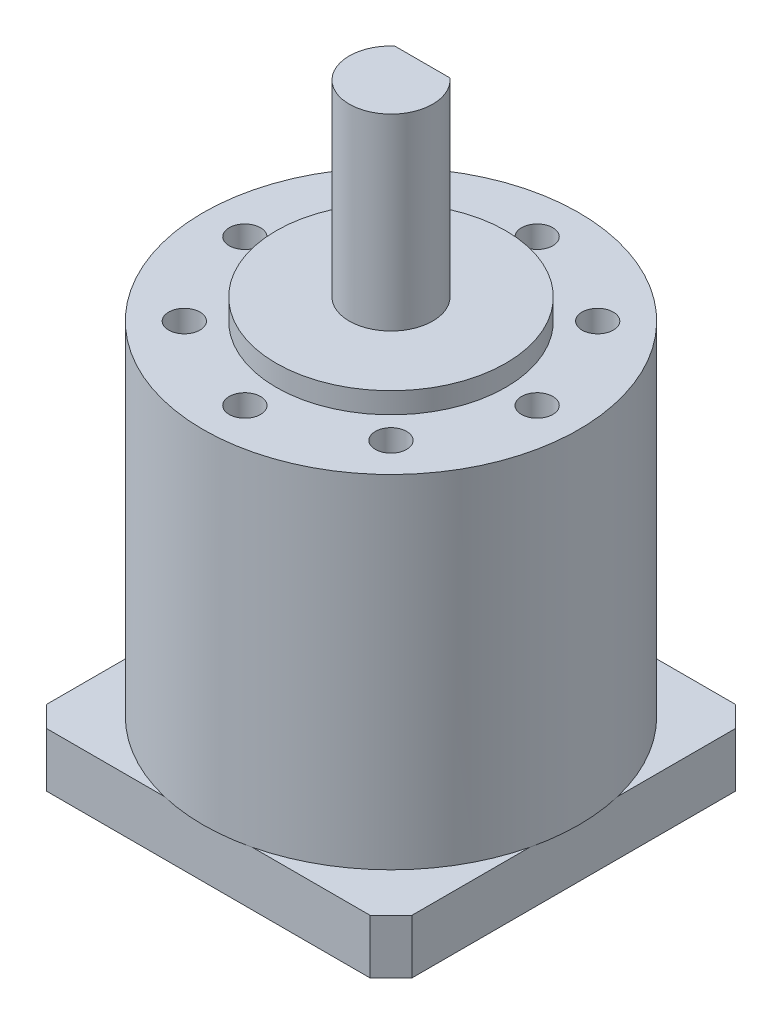
ISO-10303-21;
HEADER;
FILE_DESCRIPTION(('STEP AP214'),'2;1');
FILE_NAME('part.step','',(''),(''),'','','');
FILE_SCHEMA(('AUTOMOTIVE_DESIGN { 1 0 10303 214 1 1 1 1 }'));
ENDSEC;
DATA;
#1=APPLICATION_CONTEXT('core data for automotive mechanical design processes');
#2=APPLICATION_PROTOCOL_DEFINITION('international standard','automotive_design',2000,#1);
#3=PRODUCT_CONTEXT('',#1,'mechanical');
#4=PRODUCT('Part','Part','',(#3));
#5=PRODUCT_RELATED_PRODUCT_CATEGORY('part','',(#4));
#6=PRODUCT_DEFINITION_FORMATION('','',#4);
#7=PRODUCT_DEFINITION_CONTEXT('part definition',#1,'design');
#8=PRODUCT_DEFINITION('design','',#6,#7);
#9=PRODUCT_DEFINITION_SHAPE('','',#8);
#10=(LENGTH_UNIT() NAMED_UNIT(*) SI_UNIT(.MILLI.,.METRE.));
#11=(NAMED_UNIT(*) PLANE_ANGLE_UNIT() SI_UNIT($,.RADIAN.));
#12=(NAMED_UNIT(*) SI_UNIT($,.STERADIAN.) SOLID_ANGLE_UNIT());
#13=UNCERTAINTY_MEASURE_WITH_UNIT(LENGTH_MEASURE(1.E-05),#10,'distance_accuracy_value','');
#14=(GEOMETRIC_REPRESENTATION_CONTEXT(3) GLOBAL_UNCERTAINTY_ASSIGNED_CONTEXT((#13)) GLOBAL_UNIT_ASSIGNED_CONTEXT((#10,
#11,#12)) REPRESENTATION_CONTEXT('',''));
#15=CARTESIAN_POINT('',(0.,0.,0.));
#16=DIRECTION('',(0.,0.,1.));
#17=DIRECTION('',(1.,0.,0.));
#18=AXIS2_PLACEMENT_3D('',#15,#16,#17);
#19=CARTESIAN_POINT('',(0.,5.2,0.));
#20=DIRECTION('',(0.,1.,0.));
#21=DIRECTION('',(0.,0.,1.));
#22=AXIS2_PLACEMENT_3D('',#19,#20,#21);
#23=PLANE('',#22);
#24=DIRECTION('',(1.,0.,0.));
#25=VECTOR('',#24,1.);
#26=CARTESIAN_POINT('',(-17.5,5.2,17.5));
#27=LINE('',#26,#25);
#28=CARTESIAN_POINT('',(4.21307488658817,5.2,17.5));
#29=VERTEX_POINT('',#28);
#30=CARTESIAN_POINT('',(15.5,5.2,17.5));
#31=VERTEX_POINT('',#30);
#32=EDGE_CURVE('E197',#29,#31,#27,.T.);
#33=ORIENTED_EDGE('',*,*,#32,.T.);
#34=DIRECTION('',(-0.707106781186548,0.,0.707106781186547));
#35=VECTOR('',#34,1.);
#36=CARTESIAN_POINT('',(16.5,5.2,16.5));
#37=LINE('',#36,#35);
#38=CARTESIAN_POINT('',(17.5,5.2,15.5));
#39=VERTEX_POINT('',#38);
#40=EDGE_CURVE('E238',#31,#39,#37,.F.);
#41=ORIENTED_EDGE('',*,*,#40,.T.);
#42=DIRECTION('',(0.,0.,-1.));
#43=VECTOR('',#42,1.);
#44=CARTESIAN_POINT('',(17.5,5.2,-17.5));
#45=LINE('',#44,#43);
#46=CARTESIAN_POINT('',(17.5,5.2,4.21307488658818));
#47=VERTEX_POINT('',#46);
#48=EDGE_CURVE('E186',#39,#47,#45,.T.);
#49=ORIENTED_EDGE('',*,*,#48,.T.);
#50=CARTESIAN_POINT('',(0.,5.2,0.));
#51=DIRECTION('',(0.,1.,0.));
#52=DIRECTION('',(0.,0.,1.));
#53=AXIS2_PLACEMENT_3D('',#50,#51,#52);
#54=CIRCLE('',#53,18.);
#55=EDGE_CURVE('E181',#29,#47,#54,.T.);
#56=ORIENTED_EDGE('',*,*,#55,.F.);
#57=EDGE_LOOP('',(#33,#41,#49,#56));
#58=FACE_BOUND('',#57,.T.);
#59=ADVANCED_FACE('F40',(#58),#23,.T.);
#60=CARTESIAN_POINT('',(17.5,5.2,-4.21307488658819));
#61=VERTEX_POINT('',#60);
#62=CARTESIAN_POINT('',(17.5,5.2,-15.5));
#63=VERTEX_POINT('',#62);
#64=EDGE_CURVE('E190',#61,#63,#45,.T.);
#65=ORIENTED_EDGE('',*,*,#64,.T.);
#66=DIRECTION('',(0.707106781186546,0.,0.707106781186549));
#67=VECTOR('',#66,1.);
#68=CARTESIAN_POINT('',(16.5,5.2,-16.5));
#69=LINE('',#68,#67);
#70=CARTESIAN_POINT('',(15.5,5.2,-17.5));
#71=VERTEX_POINT('',#70);
#72=EDGE_CURVE('E231',#63,#71,#69,.F.);
#73=ORIENTED_EDGE('',*,*,#72,.T.);
#74=DIRECTION('',(-1.,0.,0.));
#75=VECTOR('',#74,1.);
#76=CARTESIAN_POINT('',(-17.5,5.2,-17.5));
#77=LINE('',#76,#75);
#78=CARTESIAN_POINT('',(4.21307488658817,5.2,-17.5));
#79=VERTEX_POINT('',#78);
#80=EDGE_CURVE('E191',#71,#79,#77,.T.);
#81=ORIENTED_EDGE('',*,*,#80,.T.);
#82=EDGE_CURVE('E176',#61,#79,#54,.T.);
#83=ORIENTED_EDGE('',*,*,#82,.F.);
#84=EDGE_LOOP('',(#65,#73,#81,#83));
#85=FACE_BOUND('',#84,.T.);
#86=ADVANCED_FACE('F324',(#85),#23,.T.);
#87=CARTESIAN_POINT('',(-4.21307488658817,5.2,-17.5));
#88=VERTEX_POINT('',#87);
#89=CARTESIAN_POINT('',(-15.5,5.2,-17.5));
#90=VERTEX_POINT('',#89);
#91=EDGE_CURVE('E188',#88,#90,#77,.T.);
#92=ORIENTED_EDGE('',*,*,#91,.T.);
#93=DIRECTION('',(0.707106781186548,0.,-0.707106781186548));
#94=VECTOR('',#93,1.);
#95=CARTESIAN_POINT('',(-16.5,5.2,-16.5));
#96=LINE('',#95,#94);
#97=CARTESIAN_POINT('',(-17.5,5.2,-15.5));
#98=VERTEX_POINT('',#97);
#99=EDGE_CURVE('E11',#90,#98,#96,.F.);
#100=ORIENTED_EDGE('',*,*,#99,.T.);
#101=DIRECTION('',(0.,0.,1.));
#102=VECTOR('',#101,1.);
#103=CARTESIAN_POINT('',(-17.5,5.2,-17.5));
#104=LINE('',#103,#102);
#105=CARTESIAN_POINT('',(-17.5,5.2,-4.21307488658815));
#106=VERTEX_POINT('',#105);
#107=EDGE_CURVE('E195',#98,#106,#104,.T.);
#108=ORIENTED_EDGE('',*,*,#107,.T.);
#109=EDGE_CURVE('E306',#88,#106,#54,.T.);
#110=ORIENTED_EDGE('',*,*,#109,.F.);
#111=EDGE_LOOP('',(#92,#100,#108,#110));
#112=FACE_BOUND('',#111,.T.);
#113=ADVANCED_FACE('F307',(#112),#23,.T.);
#114=CARTESIAN_POINT('',(17.5,5.2,-17.5));
#115=DIRECTION('',(-1.,0.,0.));
#116=DIRECTION('',(0.,0.,1.));
#117=AXIS2_PLACEMENT_3D('',#114,#115,#116);
#118=PLANE('',#117);
#119=DIRECTION('',(0.,0.,-1.));
#120=VECTOR('',#119,1.);
#121=CARTESIAN_POINT('',(17.5,0.,-17.5));
#122=LINE('',#121,#120);
#123=CARTESIAN_POINT('',(17.5,0.,15.5));
#124=VERTEX_POINT('',#123);
#125=CARTESIAN_POINT('',(17.5,0.,-15.5));
#126=VERTEX_POINT('',#125);
#127=EDGE_CURVE('E180',#124,#126,#122,.T.);
#128=ORIENTED_EDGE('',*,*,#127,.T.);
#129=DIRECTION('',(0.,1.,0.));
#130=VECTOR('',#129,1.);
#131=CARTESIAN_POINT('',(17.5,5.2,-15.5));
#132=LINE('',#131,#130);
#133=EDGE_CURVE('E229',#126,#63,#132,.T.);
#134=ORIENTED_EDGE('',*,*,#133,.T.);
#135=ORIENTED_EDGE('',*,*,#64,.F.);
#136=EDGE_CURVE('E189',#47,#61,#45,.T.);
#137=ORIENTED_EDGE('',*,*,#136,.F.);
#138=ORIENTED_EDGE('',*,*,#48,.F.);
#139=DIRECTION('',(0.,-1.,0.));
#140=VECTOR('',#139,1.);
#141=CARTESIAN_POINT('',(17.5,5.2,15.5));
#142=LINE('',#141,#140);
#143=EDGE_CURVE('E226',#39,#124,#142,.T.);
#144=ORIENTED_EDGE('',*,*,#143,.T.);
#145=EDGE_LOOP('',(#128,#134,#135,#137,#138,#144));
#146=FACE_BOUND('',#145,.T.);
#147=ADVANCED_FACE('F278',(#146),#118,.F.);
#148=CARTESIAN_POINT('',(-17.5,5.2,-17.5));
#149=DIRECTION('',(0.,0.,1.));
#150=DIRECTION('',(1.,0.,0.));
#151=AXIS2_PLACEMENT_3D('',#148,#149,#150);
#152=PLANE('',#151);
#153=ORIENTED_EDGE('',*,*,#80,.F.);
#154=DIRECTION('',(0.,-1.,0.));
#155=VECTOR('',#154,1.);
#156=CARTESIAN_POINT('',(15.5,5.2,-17.5));
#157=LINE('',#156,#155);
#158=CARTESIAN_POINT('',(15.5,0.,-17.5));
#159=VERTEX_POINT('',#158);
#160=EDGE_CURVE('E215',#71,#159,#157,.T.);
#161=ORIENTED_EDGE('',*,*,#160,.T.);
#162=DIRECTION('',(-1.,0.,0.));
#163=VECTOR('',#162,1.);
#164=CARTESIAN_POINT('',(-17.5,0.,-17.5));
#165=LINE('',#164,#163);
#166=CARTESIAN_POINT('',(-15.5,0.,-17.5));
#167=VERTEX_POINT('',#166);
#168=EDGE_CURVE('E204',#159,#167,#165,.T.);
#169=ORIENTED_EDGE('',*,*,#168,.T.);
#170=DIRECTION('',(0.,1.,0.));
#171=VECTOR('',#170,1.);
#172=CARTESIAN_POINT('',(-15.5,5.2,-17.5));
#173=LINE('',#172,#171);
#174=EDGE_CURVE('E213',#167,#90,#173,.T.);
#175=ORIENTED_EDGE('',*,*,#174,.T.);
#176=ORIENTED_EDGE('',*,*,#91,.F.);
#177=EDGE_CURVE('E194',#79,#88,#77,.T.);
#178=ORIENTED_EDGE('',*,*,#177,.F.);
#179=EDGE_LOOP('',(#153,#161,#169,#175,#176,#178));
#180=FACE_BOUND('',#179,.T.);
#181=ADVANCED_FACE('F268',(#180),#152,.F.);
#182=CARTESIAN_POINT('',(-17.5,5.2,-17.5));
#183=DIRECTION('',(1.,0.,0.));
#184=DIRECTION('',(0.,0.,-1.));
#185=AXIS2_PLACEMENT_3D('',#182,#183,#184);
#186=PLANE('',#185);
#187=DIRECTION('',(0.,0.,1.));
#188=VECTOR('',#187,1.);
#189=CARTESIAN_POINT('',(-17.5,0.,-17.5));
#190=LINE('',#189,#188);
#191=CARTESIAN_POINT('',(-17.5,0.,-15.5));
#192=VERTEX_POINT('',#191);
#193=CARTESIAN_POINT('',(-17.5,0.,15.5));
#194=VERTEX_POINT('',#193);
#195=EDGE_CURVE('E207',#192,#194,#190,.T.);
#196=ORIENTED_EDGE('',*,*,#195,.T.);
#197=DIRECTION('',(0.,1.,0.));
#198=VECTOR('',#197,1.);
#199=CARTESIAN_POINT('',(-17.5,5.2,15.5));
#200=LINE('',#199,#198);
#201=CARTESIAN_POINT('',(-17.5,5.2,15.5));
#202=VERTEX_POINT('',#201);
#203=EDGE_CURVE('E62',#194,#202,#200,.T.);
#204=ORIENTED_EDGE('',*,*,#203,.T.);
#205=CARTESIAN_POINT('',(-17.5,5.2,4.21307488658816));
#206=VERTEX_POINT('',#205);
#207=EDGE_CURVE('E193',#206,#202,#104,.T.);
#208=ORIENTED_EDGE('',*,*,#207,.F.);
#209=EDGE_CURVE('E198',#106,#206,#104,.T.);
#210=ORIENTED_EDGE('',*,*,#209,.F.);
#211=ORIENTED_EDGE('',*,*,#107,.F.);
#212=DIRECTION('',(0.,-1.,0.));
#213=VECTOR('',#212,1.);
#214=CARTESIAN_POINT('',(-17.5,5.2,-15.5));
#215=LINE('',#214,#213);
#216=EDGE_CURVE('E240',#98,#192,#215,.T.);
#217=ORIENTED_EDGE('',*,*,#216,.T.);
#218=EDGE_LOOP('',(#196,#204,#208,#210,#211,#217));
#219=FACE_BOUND('',#218,.T.);
#220=ADVANCED_FACE('F261',(#219),#186,.F.);
#221=CARTESIAN_POINT('',(-17.5,5.2,17.5));
#222=DIRECTION('',(0.,0.,-1.));
#223=DIRECTION('',(-1.,0.,0.));
#224=AXIS2_PLACEMENT_3D('',#221,#222,#223);
#225=PLANE('',#224);
#226=DIRECTION('',(1.,0.,0.));
#227=VECTOR('',#226,1.);
#228=CARTESIAN_POINT('',(-17.5,0.,17.5));
#229=LINE('',#228,#227);
#230=CARTESIAN_POINT('',(-15.5,0.,17.5));
#231=VERTEX_POINT('',#230);
#232=CARTESIAN_POINT('',(15.5,0.,17.5));
#233=VERTEX_POINT('',#232);
#234=EDGE_CURVE('E209',#231,#233,#229,.T.);
#235=ORIENTED_EDGE('',*,*,#234,.T.);
#236=DIRECTION('',(0.,1.,0.));
#237=VECTOR('',#236,1.);
#238=CARTESIAN_POINT('',(15.5,5.2,17.5));
#239=LINE('',#238,#237);
#240=EDGE_CURVE('E236',#233,#31,#239,.T.);
#241=ORIENTED_EDGE('',*,*,#240,.T.);
#242=ORIENTED_EDGE('',*,*,#32,.F.);
#243=CARTESIAN_POINT('',(-4.21307488658817,5.2,17.5));
#244=VERTEX_POINT('',#243);
#245=EDGE_CURVE('E201',#244,#29,#27,.T.);
#246=ORIENTED_EDGE('',*,*,#245,.F.);
#247=CARTESIAN_POINT('',(-15.5,5.2,17.5));
#248=VERTEX_POINT('',#247);
#249=EDGE_CURVE('E199',#248,#244,#27,.T.);
#250=ORIENTED_EDGE('',*,*,#249,.F.);
#251=DIRECTION('',(0.,-1.,0.));
#252=VECTOR('',#251,1.);
#253=CARTESIAN_POINT('',(-15.5,5.2,17.5));
#254=LINE('',#253,#252);
#255=EDGE_CURVE('E233',#248,#231,#254,.T.);
#256=ORIENTED_EDGE('',*,*,#255,.T.);
#257=EDGE_LOOP('',(#235,#241,#242,#246,#250,#256));
#258=FACE_BOUND('',#257,.T.);
#259=ADVANCED_FACE('F251',(#258),#225,.F.);
#260=ORIENTED_EDGE('',*,*,#207,.T.);
#261=DIRECTION('',(-0.707106781186548,0.,-0.707106781186548));
#262=VECTOR('',#261,1.);
#263=CARTESIAN_POINT('',(-16.5,5.2,16.5));
#264=LINE('',#263,#262);
#265=EDGE_CURVE('E49',#202,#248,#264,.F.);
#266=ORIENTED_EDGE('',*,*,#265,.T.);
#267=ORIENTED_EDGE('',*,*,#249,.T.);
#268=EDGE_CURVE('E185',#206,#244,#54,.T.);
#269=ORIENTED_EDGE('',*,*,#268,.F.);
#270=EDGE_LOOP('',(#260,#266,#267,#269));
#271=FACE_BOUND('',#270,.T.);
#272=ADVANCED_FACE('F246',(#271),#23,.T.);
#273=CARTESIAN_POINT('',(0.,0.,0.));
#274=DIRECTION('',(0.,1.,0.));
#275=DIRECTION('',(0.,0.,1.));
#276=AXIS2_PLACEMENT_3D('',#273,#274,#275);
#277=PLANE('',#276);
#278=ORIENTED_EDGE('',*,*,#168,.F.);
#279=DIRECTION('',(-0.707106781186546,0.,-0.707106781186549));
#280=VECTOR('',#279,1.);
#281=CARTESIAN_POINT('',(15.5,0.,-17.5));
#282=LINE('',#281,#280);
#283=EDGE_CURVE('E224',#159,#126,#282,.F.);
#284=ORIENTED_EDGE('',*,*,#283,.T.);
#285=ORIENTED_EDGE('',*,*,#127,.F.);
#286=DIRECTION('',(0.707106781186548,0.,-0.707106781186547));
#287=VECTOR('',#286,1.);
#288=CARTESIAN_POINT('',(17.5,0.,15.5));
#289=LINE('',#288,#287);
#290=EDGE_CURVE('E222',#124,#233,#289,.F.);
#291=ORIENTED_EDGE('',*,*,#290,.T.);
#292=ORIENTED_EDGE('',*,*,#234,.F.);
#293=DIRECTION('',(0.707106781186548,0.,0.707106781186548));
#294=VECTOR('',#293,1.);
#295=CARTESIAN_POINT('',(-15.5,0.,17.5));
#296=LINE('',#295,#294);
#297=EDGE_CURVE('E220',#231,#194,#296,.F.);
#298=ORIENTED_EDGE('',*,*,#297,.T.);
#299=ORIENTED_EDGE('',*,*,#195,.F.);
#300=DIRECTION('',(-0.707106781186548,0.,0.707106781186548));
#301=VECTOR('',#300,1.);
#302=CARTESIAN_POINT('',(-17.5,0.,-15.5));
#303=LINE('',#302,#301);
#304=EDGE_CURVE('E218',#192,#167,#303,.F.);
#305=ORIENTED_EDGE('',*,*,#304,.T.);
#306=EDGE_LOOP('',(#278,#284,#285,#291,#292,#298,#299,#305));
#307=FACE_BOUND('',#306,.T.);
#308=ADVANCED_FACE('F260',(#307),#277,.F.);
#309=CARTESIAN_POINT('',(0.,5.2,0.));
#310=DIRECTION('',(0.,1.,0.));
#311=DIRECTION('',(0.,0.,1.));
#312=AXIS2_PLACEMENT_3D('',#309,#310,#311);
#313=PLANE('',#312);
#314=EDGE_CURVE('E184',#47,#61,#54,.T.);
#315=ORIENTED_EDGE('',*,*,#314,.F.);
#316=ORIENTED_EDGE('',*,*,#136,.T.);
#317=EDGE_LOOP('',(#315,#316));
#318=FACE_BOUND('',#317,.T.);
#319=ADVANCED_FACE('F313',(#318),#313,.F.);
#320=EDGE_CURVE('E299',#79,#88,#54,.T.);
#321=ORIENTED_EDGE('',*,*,#320,.F.);
#322=ORIENTED_EDGE('',*,*,#177,.T.);
#323=EDGE_LOOP('',(#321,#322));
#324=FACE_BOUND('',#323,.T.);
#325=ADVANCED_FACE('F310',(#324),#313,.F.);
#326=EDGE_CURVE('E298',#106,#206,#54,.T.);
#327=ORIENTED_EDGE('',*,*,#326,.F.);
#328=ORIENTED_EDGE('',*,*,#209,.T.);
#329=EDGE_LOOP('',(#327,#328));
#330=FACE_BOUND('',#329,.T.);
#331=ADVANCED_FACE('F312',(#330),#313,.F.);
#332=EDGE_CURVE('E167',#244,#29,#54,.T.);
#333=ORIENTED_EDGE('',*,*,#332,.F.);
#334=ORIENTED_EDGE('',*,*,#245,.T.);
#335=EDGE_LOOP('',(#333,#334));
#336=FACE_BOUND('',#335,.T.);
#337=ADVANCED_FACE('F292',(#336),#313,.F.);
#338=CARTESIAN_POINT('',(0.,38.,0.));
#339=DIRECTION('',(0.,-1.,0.));
#340=DIRECTION('',(0.,0.,-1.));
#341=AXIS2_PLACEMENT_3D('',#338,#339,#340);
#342=CYLINDRICAL_SURFACE('',#341,18.);
#343=CARTESIAN_POINT('',(0.,38.,0.));
#344=DIRECTION('',(0.,1.,0.));
#345=DIRECTION('',(0.,0.,1.));
#346=AXIS2_PLACEMENT_3D('',#343,#344,#345);
#347=CIRCLE('',#346,18.);
#348=CARTESIAN_POINT('',(0.,38.,18.));
#349=VERTEX_POINT('',#348);
#350=EDGE_CURVE('E177',#349,#349,#347,.T.);
#351=ORIENTED_EDGE('',*,*,#350,.F.);
#352=EDGE_LOOP('',(#351));
#353=FACE_BOUND('',#352,.T.);
#354=ORIENTED_EDGE('',*,*,#55,.T.);
#355=ORIENTED_EDGE('',*,*,#314,.T.);
#356=ORIENTED_EDGE('',*,*,#82,.T.);
#357=ORIENTED_EDGE('',*,*,#320,.T.);
#358=ORIENTED_EDGE('',*,*,#109,.T.);
#359=ORIENTED_EDGE('',*,*,#326,.T.);
#360=ORIENTED_EDGE('',*,*,#268,.T.);
#361=ORIENTED_EDGE('',*,*,#332,.T.);
#362=EDGE_LOOP('',(#354,#355,#356,#357,#358,#359,#360,#361));
#363=FACE_BOUND('',#362,.T.);
#364=ADVANCED_FACE('F295',(#353,#363),#342,.T.);
#365=CARTESIAN_POINT('',(0.,38.,0.));
#366=DIRECTION('',(0.,1.,0.));
#367=DIRECTION('',(0.,0.,1.));
#368=AXIS2_PLACEMENT_3D('',#365,#366,#367);
#369=PLANE('',#368);
#370=CARTESIAN_POINT('',(-9.89949493661168,38.,9.89949493661165));
#371=DIRECTION('',(0.,1.,0.));
#372=DIRECTION('',(0.,0.,1.));
#373=AXIS2_PLACEMENT_3D('',#370,#371,#372);
#374=CIRCLE('',#373,1.5);
#375=CARTESIAN_POINT('',(-9.89949493661168,38.,11.3994949366117));
#376=VERTEX_POINT('',#375);
#377=EDGE_CURVE('E410',#376,#376,#374,.T.);
#378=ORIENTED_EDGE('',*,*,#377,.F.);
#379=EDGE_LOOP('',(#378));
#380=FACE_BOUND('',#379,.T.);
#381=CARTESIAN_POINT('',(9.89949493661165,38.,9.89949493661168));
#382=DIRECTION('',(0.,1.,0.));
#383=DIRECTION('',(0.,0.,1.));
#384=AXIS2_PLACEMENT_3D('',#381,#382,#383);
#385=CIRCLE('',#384,1.5);
#386=CARTESIAN_POINT('',(9.89949493661165,38.,11.3994949366117));
#387=VERTEX_POINT('',#386);
#388=EDGE_CURVE('E414',#387,#387,#385,.T.);
#389=ORIENTED_EDGE('',*,*,#388,.F.);
#390=EDGE_LOOP('',(#389));
#391=FACE_BOUND('',#390,.T.);
#392=CARTESIAN_POINT('',(9.89949493661168,38.,-9.89949493661165));
#393=DIRECTION('',(0.,1.,0.));
#394=DIRECTION('',(0.,0.,1.));
#395=AXIS2_PLACEMENT_3D('',#392,#393,#394);
#396=CIRCLE('',#395,1.5);
#397=CARTESIAN_POINT('',(9.89949493661168,38.,-8.39949493661165));
#398=VERTEX_POINT('',#397);
#399=EDGE_CURVE('E418',#398,#398,#396,.T.);
#400=ORIENTED_EDGE('',*,*,#399,.F.);
#401=EDGE_LOOP('',(#400));
#402=FACE_BOUND('',#401,.T.);
#403=CARTESIAN_POINT('',(-9.89949493661165,38.,-9.89949493661168));
#404=DIRECTION('',(0.,1.,0.));
#405=DIRECTION('',(0.,0.,1.));
#406=AXIS2_PLACEMENT_3D('',#403,#404,#405);
#407=CIRCLE('',#406,1.5);
#408=CARTESIAN_POINT('',(-9.89949493661165,38.,-8.39949493661168));
#409=VERTEX_POINT('',#408);
#410=EDGE_CURVE('E422',#409,#409,#407,.T.);
#411=ORIENTED_EDGE('',*,*,#410,.F.);
#412=EDGE_LOOP('',(#411));
#413=FACE_BOUND('',#412,.T.);
#414=CARTESIAN_POINT('',(0.,38.,-14.));
#415=DIRECTION('',(0.,1.,0.));
#416=DIRECTION('',(0.,0.,1.));
#417=AXIS2_PLACEMENT_3D('',#414,#415,#416);
#418=CIRCLE('',#417,1.5);
#419=CARTESIAN_POINT('',(0.,38.,-12.5));
#420=VERTEX_POINT('',#419);
#421=EDGE_CURVE('E426',#420,#420,#418,.T.);
#422=ORIENTED_EDGE('',*,*,#421,.F.);
#423=EDGE_LOOP('',(#422));
#424=FACE_BOUND('',#423,.T.);
#425=CARTESIAN_POINT('',(14.,38.,0.));
#426=DIRECTION('',(0.,1.,0.));
#427=DIRECTION('',(0.,0.,1.));
#428=AXIS2_PLACEMENT_3D('',#425,#426,#427);
#429=CIRCLE('',#428,1.5);
#430=CARTESIAN_POINT('',(14.,38.,1.50000000000005));
#431=VERTEX_POINT('',#430);
#432=EDGE_CURVE('E430',#431,#431,#429,.T.);
#433=ORIENTED_EDGE('',*,*,#432,.F.);
#434=EDGE_LOOP('',(#433));
#435=FACE_BOUND('',#434,.T.);
#436=CARTESIAN_POINT('',(0.,38.,14.));
#437=DIRECTION('',(0.,1.,0.));
#438=DIRECTION('',(0.,0.,1.));
#439=AXIS2_PLACEMENT_3D('',#436,#437,#438);
#440=CIRCLE('',#439,1.50000000000009);
#441=CARTESIAN_POINT('',(0.,38.,15.5000000000001));
#442=VERTEX_POINT('',#441);
#443=EDGE_CURVE('E434',#442,#442,#440,.T.);
#444=ORIENTED_EDGE('',*,*,#443,.F.);
#445=EDGE_LOOP('',(#444));
#446=FACE_BOUND('',#445,.T.);
#447=CARTESIAN_POINT('',(-14.,38.,0.));
#448=DIRECTION('',(0.,1.,0.));
#449=DIRECTION('',(0.,0.,1.));
#450=AXIS2_PLACEMENT_3D('',#447,#448,#449);
#451=CIRCLE('',#450,1.50000000000014);
#452=CARTESIAN_POINT('',(-14.,38.,1.50000000000015));
#453=VERTEX_POINT('',#452);
#454=EDGE_CURVE('E438',#453,#453,#451,.T.);
#455=ORIENTED_EDGE('',*,*,#454,.F.);
#456=EDGE_LOOP('',(#455));
#457=FACE_BOUND('',#456,.T.);
#458=CARTESIAN_POINT('',(0.,38.,0.));
#459=DIRECTION('',(0.,1.,0.));
#460=DIRECTION('',(0.,0.,1.));
#461=AXIS2_PLACEMENT_3D('',#458,#459,#460);
#462=CIRCLE('',#461,11.);
#463=CARTESIAN_POINT('',(0.,38.,11.));
#464=VERTEX_POINT('',#463);
#465=EDGE_CURVE('E172',#464,#464,#462,.T.);
#466=ORIENTED_EDGE('',*,*,#465,.F.);
#467=EDGE_LOOP('',(#466));
#468=FACE_BOUND('',#467,.T.);
#469=ORIENTED_EDGE('',*,*,#350,.T.);
#470=EDGE_LOOP('',(#469));
#471=FACE_BOUND('',#470,.T.);
#472=ADVANCED_FACE('F397',(#380,#391,#402,#413,#424,#435,#446,#457,#468,#471),#369,.T.);
#473=CARTESIAN_POINT('',(0.,40.,0.));
#474=DIRECTION('',(0.,-1.,0.));
#475=DIRECTION('',(0.,0.,-1.));
#476=AXIS2_PLACEMENT_3D('',#473,#474,#475);
#477=CYLINDRICAL_SURFACE('',#476,11.);
#478=CARTESIAN_POINT('',(0.,40.,0.));
#479=DIRECTION('',(0.,1.,0.));
#480=DIRECTION('',(0.,0.,1.));
#481=AXIS2_PLACEMENT_3D('',#478,#479,#480);
#482=CIRCLE('',#481,11.);
#483=CARTESIAN_POINT('',(0.,40.,11.));
#484=VERTEX_POINT('',#483);
#485=EDGE_CURVE('E164',#484,#484,#482,.T.);
#486=ORIENTED_EDGE('',*,*,#485,.F.);
#487=EDGE_LOOP('',(#486));
#488=FACE_BOUND('',#487,.T.);
#489=ORIENTED_EDGE('',*,*,#465,.T.);
#490=EDGE_LOOP('',(#489));
#491=FACE_BOUND('',#490,.T.);
#492=ADVANCED_FACE('F394',(#488,#491),#477,.T.);
#493=CARTESIAN_POINT('',(0.,40.,0.));
#494=DIRECTION('',(0.,1.,0.));
#495=DIRECTION('',(0.,0.,1.));
#496=AXIS2_PLACEMENT_3D('',#493,#494,#495);
#497=PLANE('',#496);
#498=CARTESIAN_POINT('',(0.,40.,0.));
#499=DIRECTION('',(0.,1.,0.));
#500=DIRECTION('',(0.,0.,1.));
#501=AXIS2_PLACEMENT_3D('',#498,#499,#500);
#502=CIRCLE('',#501,4.);
#503=CARTESIAN_POINT('',(0.,40.,4.));
#504=VERTEX_POINT('',#503);
#505=EDGE_CURVE('E154',#504,#504,#502,.T.);
#506=ORIENTED_EDGE('',*,*,#505,.F.);
#507=EDGE_LOOP('',(#506));
#508=FACE_BOUND('',#507,.T.);
#509=ORIENTED_EDGE('',*,*,#485,.T.);
#510=EDGE_LOOP('',(#509));
#511=FACE_BOUND('',#510,.T.);
#512=ADVANCED_FACE('F391',(#508,#511),#497,.T.);
#513=CARTESIAN_POINT('',(0.,58.,0.));
#514=DIRECTION('',(0.,-1.,0.));
#515=DIRECTION('',(0.,0.,-1.));
#516=AXIS2_PLACEMENT_3D('',#513,#514,#515);
#517=CYLINDRICAL_SURFACE('',#516,4.);
#518=CARTESIAN_POINT('',(0.,58.,0.));
#519=DIRECTION('',(0.,1.,0.));
#520=DIRECTION('',(0.,0.,1.));
#521=AXIS2_PLACEMENT_3D('',#518,#519,#520);
#522=CIRCLE('',#521,4.);
#523=CARTESIAN_POINT('',(-2.64575131106459,58.,-3.));
#524=VERTEX_POINT('',#523);
#525=CARTESIAN_POINT('',(2.64575131106459,58.,-3.));
#526=VERTEX_POINT('',#525);
#527=EDGE_CURVE('E160',#524,#526,#522,.T.);
#528=ORIENTED_EDGE('',*,*,#527,.F.);
#529=DIRECTION('',(0.,-1.,0.));
#530=VECTOR('',#529,1.);
#531=CARTESIAN_POINT('',(-2.64575131106459,58.,-3.));
#532=LINE('',#531,#530);
#533=CARTESIAN_POINT('',(-2.64575131106459,43.,-3.));
#534=VERTEX_POINT('',#533);
#535=EDGE_CURVE('E149',#524,#534,#532,.T.);
#536=ORIENTED_EDGE('',*,*,#535,.T.);
#537=CARTESIAN_POINT('',(0.,43.,0.));
#538=DIRECTION('',(0.,-1.,0.));
#539=DIRECTION('',(0.,0.,-1.));
#540=AXIS2_PLACEMENT_3D('',#537,#538,#539);
#541=CIRCLE('',#540,4.);
#542=CARTESIAN_POINT('',(2.64575131106459,43.,-3.));
#543=VERTEX_POINT('',#542);
#544=EDGE_CURVE('E153',#534,#543,#541,.T.);
#545=ORIENTED_EDGE('',*,*,#544,.T.);
#546=DIRECTION('',(0.,-1.,0.));
#547=VECTOR('',#546,1.);
#548=CARTESIAN_POINT('',(2.64575131106459,58.,-3.));
#549=LINE('',#548,#547);
#550=EDGE_CURVE('E146',#543,#526,#549,.F.);
#551=ORIENTED_EDGE('',*,*,#550,.T.);
#552=EDGE_LOOP('',(#528,#536,#545,#551));
#553=FACE_BOUND('',#552,.T.);
#554=ORIENTED_EDGE('',*,*,#505,.T.);
#555=EDGE_LOOP('',(#554));
#556=FACE_BOUND('',#555,.T.);
#557=ADVANCED_FACE('F158',(#553,#556),#517,.T.);
#558=CARTESIAN_POINT('',(0.,58.,0.));
#559=DIRECTION('',(0.,1.,0.));
#560=DIRECTION('',(0.,0.,1.));
#561=AXIS2_PLACEMENT_3D('',#558,#559,#560);
#562=PLANE('',#561);
#563=DIRECTION('',(1.,0.,0.));
#564=VECTOR('',#563,1.);
#565=CARTESIAN_POINT('',(0.,58.,-3.));
#566=LINE('',#565,#564);
#567=EDGE_CURVE('E142',#524,#526,#566,.T.);
#568=ORIENTED_EDGE('',*,*,#567,.F.);
#569=ORIENTED_EDGE('',*,*,#527,.T.);
#570=EDGE_LOOP('',(#568,#569));
#571=FACE_BOUND('',#570,.T.);
#572=ADVANCED_FACE('F163',(#571),#562,.T.);
#573=CARTESIAN_POINT('',(0.,43.,0.));
#574=DIRECTION('',(0.,-1.,0.));
#575=DIRECTION('',(0.,0.,-1.));
#576=AXIS2_PLACEMENT_3D('',#573,#574,#575);
#577=PLANE('',#576);
#578=DIRECTION('',(1.,0.,0.));
#579=VECTOR('',#578,1.);
#580=CARTESIAN_POINT('',(5.27340823970037,43.,-3.));
#581=LINE('',#580,#579);
#582=EDGE_CURVE('E161',#534,#543,#581,.T.);
#583=ORIENTED_EDGE('',*,*,#582,.T.);
#584=ORIENTED_EDGE('',*,*,#544,.F.);
#585=EDGE_LOOP('',(#583,#584));
#586=FACE_BOUND('',#585,.T.);
#587=ADVANCED_FACE('F381',(#586),#577,.F.);
#588=CARTESIAN_POINT('',(5.27340823970037,43.,-3.));
#589=DIRECTION('',(0.,0.,1.));
#590=DIRECTION('',(1.,0.,0.));
#591=AXIS2_PLACEMENT_3D('',#588,#589,#590);
#592=PLANE('',#591);
#593=ORIENTED_EDGE('',*,*,#567,.T.);
#594=ORIENTED_EDGE('',*,*,#550,.F.);
#595=ORIENTED_EDGE('',*,*,#582,.F.);
#596=ORIENTED_EDGE('',*,*,#535,.F.);
#597=EDGE_LOOP('',(#593,#594,#595,#596));
#598=FACE_BOUND('',#597,.T.);
#599=ADVANCED_FACE('F144',(#598),#592,.F.);
#600=CARTESIAN_POINT('',(15.5,5.2,-17.5));
#601=DIRECTION('',(-0.707106781186549,0.,0.707106781186546));
#602=DIRECTION('',(0.,-1.,0.));
#603=AXIS2_PLACEMENT_3D('',#600,#601,#602);
#604=PLANE('',#603);
#605=ORIENTED_EDGE('',*,*,#72,.F.);
#606=ORIENTED_EDGE('',*,*,#133,.F.);
#607=ORIENTED_EDGE('',*,*,#283,.F.);
#608=ORIENTED_EDGE('',*,*,#160,.F.);
#609=EDGE_LOOP('',(#605,#606,#607,#608));
#610=FACE_BOUND('',#609,.T.);
#611=ADVANCED_FACE('F274',(#610),#604,.F.);
#612=CARTESIAN_POINT('',(17.5,5.2,15.5));
#613=DIRECTION('',(-0.707106781186547,0.,-0.707106781186548));
#614=DIRECTION('',(0.,-1.,0.));
#615=AXIS2_PLACEMENT_3D('',#612,#613,#614);
#616=PLANE('',#615);
#617=ORIENTED_EDGE('',*,*,#40,.F.);
#618=ORIENTED_EDGE('',*,*,#240,.F.);
#619=ORIENTED_EDGE('',*,*,#290,.F.);
#620=ORIENTED_EDGE('',*,*,#143,.F.);
#621=EDGE_LOOP('',(#617,#618,#619,#620));
#622=FACE_BOUND('',#621,.T.);
#623=ADVANCED_FACE('F286',(#622),#616,.F.);
#624=CARTESIAN_POINT('',(-15.5,5.2,17.5));
#625=DIRECTION('',(0.707106781186547,0.,-0.707106781186547));
#626=DIRECTION('',(0.,-1.,0.));
#627=AXIS2_PLACEMENT_3D('',#624,#625,#626);
#628=PLANE('',#627);
#629=ORIENTED_EDGE('',*,*,#265,.F.);
#630=ORIENTED_EDGE('',*,*,#203,.F.);
#631=ORIENTED_EDGE('',*,*,#297,.F.);
#632=ORIENTED_EDGE('',*,*,#255,.F.);
#633=EDGE_LOOP('',(#629,#630,#631,#632));
#634=FACE_BOUND('',#633,.T.);
#635=ADVANCED_FACE('F256',(#634),#628,.F.);
#636=CARTESIAN_POINT('',(-17.5,5.2,-15.5));
#637=DIRECTION('',(0.707106781186547,0.,0.707106781186547));
#638=DIRECTION('',(0.,-1.,0.));
#639=AXIS2_PLACEMENT_3D('',#636,#637,#638);
#640=PLANE('',#639);
#641=ORIENTED_EDGE('',*,*,#99,.F.);
#642=ORIENTED_EDGE('',*,*,#174,.F.);
#643=ORIENTED_EDGE('',*,*,#304,.F.);
#644=ORIENTED_EDGE('',*,*,#216,.F.);
#645=EDGE_LOOP('',(#641,#642,#643,#644));
#646=FACE_BOUND('',#645,.T.);
#647=ADVANCED_FACE('F43',(#646),#640,.F.);
#648=CARTESIAN_POINT('',(-14.,32.,0.));
#649=DIRECTION('',(0.,1.,0.));
#650=DIRECTION('',(0.,0.,1.));
#651=AXIS2_PLACEMENT_3D('',#648,#649,#650);
#652=CYLINDRICAL_SURFACE('',#651,1.50000000000014);
#653=CARTESIAN_POINT('',(-14.,32.,0.));
#654=DIRECTION('',(0.,1.,0.));
#655=DIRECTION('',(0.,0.,1.));
#656=AXIS2_PLACEMENT_3D('',#653,#654,#655);
#657=CIRCLE('',#656,1.50000000000014);
#658=CARTESIAN_POINT('',(-14.,32.,1.50000000000015));
#659=VERTEX_POINT('',#658);
#660=EDGE_CURVE('E443',#659,#659,#657,.T.);
#661=ORIENTED_EDGE('',*,*,#660,.F.);
#662=EDGE_LOOP('',(#661));
#663=FACE_BOUND('',#662,.T.);
#664=ORIENTED_EDGE('',*,*,#454,.T.);
#665=EDGE_LOOP('',(#664));
#666=FACE_BOUND('',#665,.T.);
#667=ADVANCED_FACE('F364',(#663,#666),#652,.F.);
#668=CARTESIAN_POINT('',(-14.,32.,0.));
#669=DIRECTION('',(0.,1.,0.));
#670=DIRECTION('',(0.,0.,1.));
#671=AXIS2_PLACEMENT_3D('',#668,#669,#670);
#672=PLANE('',#671);
#673=ORIENTED_EDGE('',*,*,#660,.T.);
#674=EDGE_LOOP('',(#673));
#675=FACE_BOUND('',#674,.T.);
#676=ADVANCED_FACE('F368',(#675),#672,.T.);
#677=CARTESIAN_POINT('',(0.,32.,14.));
#678=DIRECTION('',(0.,1.,0.));
#679=DIRECTION('',(0.,0.,1.));
#680=AXIS2_PLACEMENT_3D('',#677,#678,#679);
#681=CYLINDRICAL_SURFACE('',#680,1.50000000000009);
#682=CARTESIAN_POINT('',(0.,32.,14.));
#683=DIRECTION('',(0.,1.,0.));
#684=DIRECTION('',(0.,0.,1.));
#685=AXIS2_PLACEMENT_3D('',#682,#683,#684);
#686=CIRCLE('',#685,1.50000000000009);
#687=CARTESIAN_POINT('',(0.,32.,15.5000000000001));
#688=VERTEX_POINT('',#687);
#689=EDGE_CURVE('E464',#688,#688,#686,.T.);
#690=ORIENTED_EDGE('',*,*,#689,.F.);
#691=EDGE_LOOP('',(#690));
#692=FACE_BOUND('',#691,.T.);
#693=ORIENTED_EDGE('',*,*,#443,.T.);
#694=EDGE_LOOP('',(#693));
#695=FACE_BOUND('',#694,.T.);
#696=ADVANCED_FACE('F374',(#692,#695),#681,.F.);
#697=CARTESIAN_POINT('',(0.,32.,14.));
#698=DIRECTION('',(0.,1.,0.));
#699=DIRECTION('',(0.,0.,1.));
#700=AXIS2_PLACEMENT_3D('',#697,#698,#699);
#701=PLANE('',#700);
#702=ORIENTED_EDGE('',*,*,#689,.T.);
#703=EDGE_LOOP('',(#702));
#704=FACE_BOUND('',#703,.T.);
#705=ADVANCED_FACE('F468',(#704),#701,.T.);
#706=CARTESIAN_POINT('',(14.,32.,0.));
#707=DIRECTION('',(0.,1.,0.));
#708=DIRECTION('',(0.,0.,1.));
#709=AXIS2_PLACEMENT_3D('',#706,#707,#708);
#710=CYLINDRICAL_SURFACE('',#709,1.5);
#711=CARTESIAN_POINT('',(14.,32.,0.));
#712=DIRECTION('',(0.,1.,0.));
#713=DIRECTION('',(0.,0.,1.));
#714=AXIS2_PLACEMENT_3D('',#711,#712,#713);
#715=CIRCLE('',#714,1.5);
#716=CARTESIAN_POINT('',(14.,32.,1.50000000000005));
#717=VERTEX_POINT('',#716);
#718=EDGE_CURVE('E457',#717,#717,#715,.T.);
#719=ORIENTED_EDGE('',*,*,#718,.F.);
#720=EDGE_LOOP('',(#719));
#721=FACE_BOUND('',#720,.T.);
#722=ORIENTED_EDGE('',*,*,#432,.T.);
#723=EDGE_LOOP('',(#722));
#724=FACE_BOUND('',#723,.T.);
#725=ADVANCED_FACE('F473',(#721,#724),#710,.F.);
#726=CARTESIAN_POINT('',(14.,32.,0.));
#727=DIRECTION('',(0.,1.,0.));
#728=DIRECTION('',(0.,0.,1.));
#729=AXIS2_PLACEMENT_3D('',#726,#727,#728);
#730=PLANE('',#729);
#731=ORIENTED_EDGE('',*,*,#718,.T.);
#732=EDGE_LOOP('',(#731));
#733=FACE_BOUND('',#732,.T.);
#734=ADVANCED_FACE('F480',(#733),#730,.T.);
#735=CARTESIAN_POINT('',(0.,32.,-14.));
#736=DIRECTION('',(0.,1.,0.));
#737=DIRECTION('',(0.,0.,1.));
#738=AXIS2_PLACEMENT_3D('',#735,#736,#737);
#739=CYLINDRICAL_SURFACE('',#738,1.5);
#740=CARTESIAN_POINT('',(0.,32.,-14.));
#741=DIRECTION('',(0.,1.,0.));
#742=DIRECTION('',(0.,0.,1.));
#743=AXIS2_PLACEMENT_3D('',#740,#741,#742);
#744=CIRCLE('',#743,1.5);
#745=CARTESIAN_POINT('',(0.,32.,-12.5));
#746=VERTEX_POINT('',#745);
#747=EDGE_CURVE('E452',#746,#746,#744,.T.);
#748=ORIENTED_EDGE('',*,*,#747,.F.);
#749=EDGE_LOOP('',(#748));
#750=FACE_BOUND('',#749,.T.);
#751=ORIENTED_EDGE('',*,*,#421,.T.);
#752=EDGE_LOOP('',(#751));
#753=FACE_BOUND('',#752,.T.);
#754=ADVANCED_FACE('F484',(#750,#753),#739,.F.);
#755=CARTESIAN_POINT('',(0.,32.,-14.));
#756=DIRECTION('',(0.,1.,0.));
#757=DIRECTION('',(0.,0.,1.));
#758=AXIS2_PLACEMENT_3D('',#755,#756,#757);
#759=PLANE('',#758);
#760=ORIENTED_EDGE('',*,*,#747,.T.);
#761=EDGE_LOOP('',(#760));
#762=FACE_BOUND('',#761,.T.);
#763=ADVANCED_FACE('F488',(#762),#759,.T.);
#764=CARTESIAN_POINT('',(-9.89949493661165,32.,-9.89949493661168));
#765=DIRECTION('',(0.,1.,0.));
#766=DIRECTION('',(0.,0.,1.));
#767=AXIS2_PLACEMENT_3D('',#764,#765,#766);
#768=CYLINDRICAL_SURFACE('',#767,1.5);
#769=CARTESIAN_POINT('',(-9.89949493661165,32.,-9.89949493661168));
#770=DIRECTION('',(0.,1.,0.));
#771=DIRECTION('',(0.,0.,1.));
#772=AXIS2_PLACEMENT_3D('',#769,#770,#771);
#773=CIRCLE('',#772,1.5);
#774=CARTESIAN_POINT('',(-9.89949493661165,32.,-8.39949493661168));
#775=VERTEX_POINT('',#774);
#776=EDGE_CURVE('E444',#775,#775,#773,.T.);
#777=ORIENTED_EDGE('',*,*,#776,.F.);
#778=EDGE_LOOP('',(#777));
#779=FACE_BOUND('',#778,.T.);
#780=ORIENTED_EDGE('',*,*,#410,.T.);
#781=EDGE_LOOP('',(#780));
#782=FACE_BOUND('',#781,.T.);
#783=ADVANCED_FACE('F492',(#779,#782),#768,.F.);
#784=CARTESIAN_POINT('',(-9.89949493661165,32.,-9.89949493661168));
#785=DIRECTION('',(0.,1.,0.));
#786=DIRECTION('',(0.,0.,1.));
#787=AXIS2_PLACEMENT_3D('',#784,#785,#786);
#788=PLANE('',#787);
#789=ORIENTED_EDGE('',*,*,#776,.T.);
#790=EDGE_LOOP('',(#789));
#791=FACE_BOUND('',#790,.T.);
#792=ADVANCED_FACE('F495',(#791),#788,.T.);
#793=CARTESIAN_POINT('',(9.89949493661168,32.,-9.89949493661165));
#794=DIRECTION('',(0.,1.,0.));
#795=DIRECTION('',(0.,0.,1.));
#796=AXIS2_PLACEMENT_3D('',#793,#794,#795);
#797=CYLINDRICAL_SURFACE('',#796,1.5);
#798=CARTESIAN_POINT('',(9.89949493661168,32.,-9.89949493661165));
#799=DIRECTION('',(0.,1.,0.));
#800=DIRECTION('',(0.,0.,1.));
#801=AXIS2_PLACEMENT_3D('',#798,#799,#800);
#802=CIRCLE('',#801,1.5);
#803=CARTESIAN_POINT('',(9.89949493661168,32.,-8.39949493661165));
#804=VERTEX_POINT('',#803);
#805=EDGE_CURVE('E527',#804,#804,#802,.T.);
#806=ORIENTED_EDGE('',*,*,#805,.F.);
#807=EDGE_LOOP('',(#806));
#808=FACE_BOUND('',#807,.T.);
#809=ORIENTED_EDGE('',*,*,#399,.T.);
#810=EDGE_LOOP('',(#809));
#811=FACE_BOUND('',#810,.T.);
#812=ADVANCED_FACE('F499',(#808,#811),#797,.F.);
#813=CARTESIAN_POINT('',(9.89949493661168,32.,-9.89949493661165));
#814=DIRECTION('',(0.,1.,0.));
#815=DIRECTION('',(0.,0.,1.));
#816=AXIS2_PLACEMENT_3D('',#813,#814,#815);
#817=PLANE('',#816);
#818=ORIENTED_EDGE('',*,*,#805,.T.);
#819=EDGE_LOOP('',(#818));
#820=FACE_BOUND('',#819,.T.);
#821=ADVANCED_FACE('F513',(#820),#817,.T.);
#822=CARTESIAN_POINT('',(9.89949493661165,32.,9.89949493661168));
#823=DIRECTION('',(0.,1.,0.));
#824=DIRECTION('',(0.,0.,1.));
#825=AXIS2_PLACEMENT_3D('',#822,#823,#824);
#826=CYLINDRICAL_SURFACE('',#825,1.5);
#827=CARTESIAN_POINT('',(9.89949493661165,32.,9.89949493661168));
#828=DIRECTION('',(0.,1.,0.));
#829=DIRECTION('',(0.,0.,1.));
#830=AXIS2_PLACEMENT_3D('',#827,#828,#829);
#831=CIRCLE('',#830,1.5);
#832=CARTESIAN_POINT('',(9.89949493661165,32.,11.3994949366117));
#833=VERTEX_POINT('',#832);
#834=EDGE_CURVE('E529',#833,#833,#831,.T.);
#835=ORIENTED_EDGE('',*,*,#834,.F.);
#836=EDGE_LOOP('',(#835));
#837=FACE_BOUND('',#836,.T.);
#838=ORIENTED_EDGE('',*,*,#388,.T.);
#839=EDGE_LOOP('',(#838));
#840=FACE_BOUND('',#839,.T.);
#841=ADVANCED_FACE('F510',(#837,#840),#826,.F.);
#842=CARTESIAN_POINT('',(9.89949493661165,32.,9.89949493661168));
#843=DIRECTION('',(0.,1.,0.));
#844=DIRECTION('',(0.,0.,1.));
#845=AXIS2_PLACEMENT_3D('',#842,#843,#844);
#846=PLANE('',#845);
#847=ORIENTED_EDGE('',*,*,#834,.T.);
#848=EDGE_LOOP('',(#847));
#849=FACE_BOUND('',#848,.T.);
#850=ADVANCED_FACE('F505',(#849),#846,.T.);
#851=CARTESIAN_POINT('',(-9.89949493661168,32.,9.89949493661165));
#852=DIRECTION('',(0.,1.,0.));
#853=DIRECTION('',(0.,0.,1.));
#854=AXIS2_PLACEMENT_3D('',#851,#852,#853);
#855=CYLINDRICAL_SURFACE('',#854,1.5);
#856=CARTESIAN_POINT('',(-9.89949493661168,32.,9.89949493661165));
#857=DIRECTION('',(0.,1.,0.));
#858=DIRECTION('',(0.,0.,1.));
#859=AXIS2_PLACEMENT_3D('',#856,#857,#858);
#860=CIRCLE('',#859,1.5);
#861=CARTESIAN_POINT('',(-9.89949493661168,32.,11.3994949366117));
#862=VERTEX_POINT('',#861);
#863=EDGE_CURVE('E535',#862,#862,#860,.T.);
#864=ORIENTED_EDGE('',*,*,#863,.F.);
#865=EDGE_LOOP('',(#864));
#866=FACE_BOUND('',#865,.T.);
#867=ORIENTED_EDGE('',*,*,#377,.T.);
#868=EDGE_LOOP('',(#867));
#869=FACE_BOUND('',#868,.T.);
#870=ADVANCED_FACE('F501',(#866,#869),#855,.F.);
#871=CARTESIAN_POINT('',(-9.89949493661168,32.,9.89949493661165));
#872=DIRECTION('',(0.,1.,0.));
#873=DIRECTION('',(0.,0.,1.));
#874=AXIS2_PLACEMENT_3D('',#871,#872,#873);
#875=PLANE('',#874);
#876=ORIENTED_EDGE('',*,*,#863,.T.);
#877=EDGE_LOOP('',(#876));
#878=FACE_BOUND('',#877,.T.);
#879=ADVANCED_FACE('F504',(#878),#875,.T.);
#880=CLOSED_SHELL('',(#59,#86,#113,#147,#181,#220,#259,#272,#308,#319,#325,#331,#337,#364,#472,
#492,#512,#557,#572,#587,#599,#611,#623,#635,#647,#667,#676,#696,#705,#725,#734,#754,#763,#783,
#792,#812,#821,#841,#850,#870,#879));
#881=MANIFOLD_SOLID_BREP('B2',#880);
#882=ADVANCED_BREP_SHAPE_REPRESENTATION('',(#18,#881),#14);
#883=SHAPE_DEFINITION_REPRESENTATION(#9,#882);
ENDSEC;
END-ISO-10303-21;
